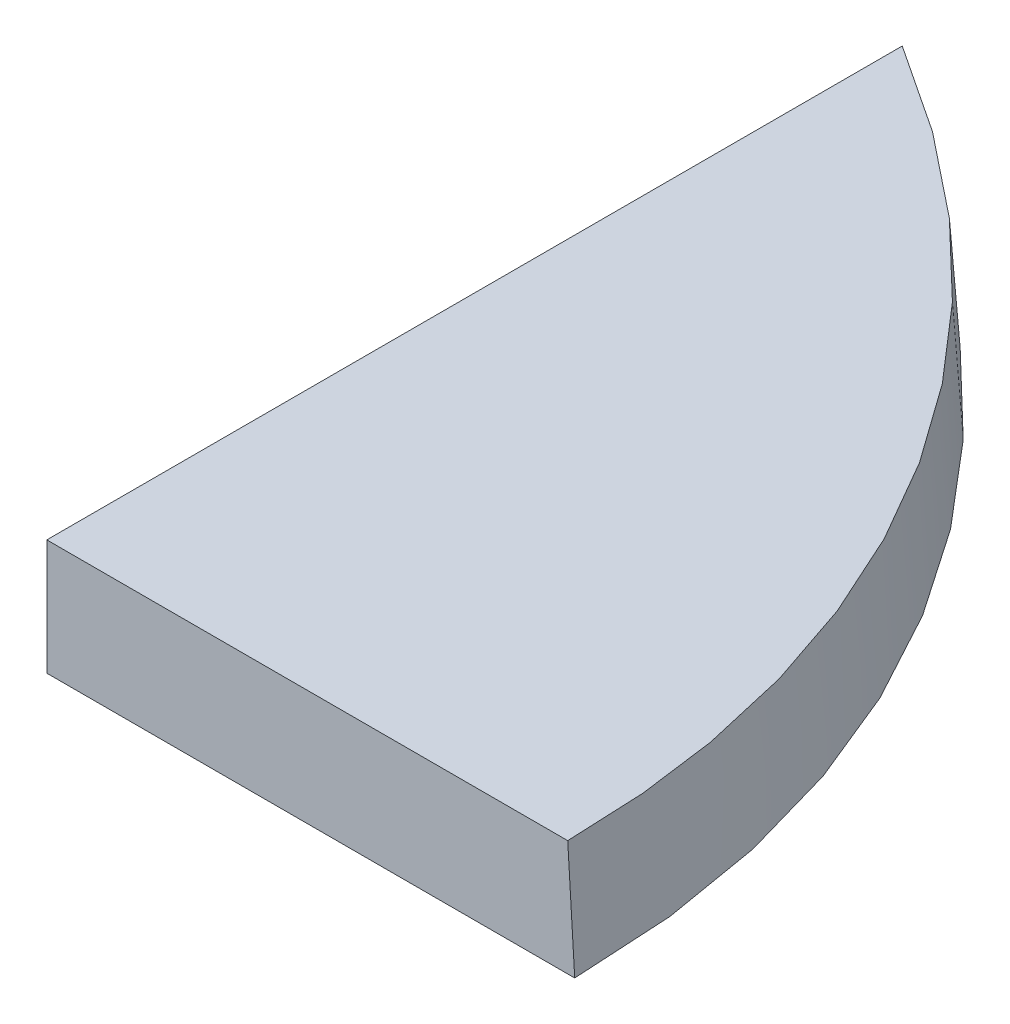
ISO-10303-21;
HEADER;
FILE_DESCRIPTION(('STEP AP214'),'2;1');
FILE_NAME('part.step','',(''),(''),'','','');
FILE_SCHEMA(('AUTOMOTIVE_DESIGN { 1 0 10303 214 1 1 1 1 }'));
ENDSEC;
DATA;
#1=APPLICATION_CONTEXT('core data for automotive mechanical design processes');
#2=APPLICATION_PROTOCOL_DEFINITION('international standard','automotive_design',2000,#1);
#3=PRODUCT_CONTEXT('',#1,'mechanical');
#4=PRODUCT('Part','Part','',(#3));
#5=PRODUCT_RELATED_PRODUCT_CATEGORY('part','',(#4));
#6=PRODUCT_DEFINITION_FORMATION('','',#4);
#7=PRODUCT_DEFINITION_CONTEXT('part definition',#1,'design');
#8=PRODUCT_DEFINITION('design','',#6,#7);
#9=PRODUCT_DEFINITION_SHAPE('','',#8);
#10=(LENGTH_UNIT() NAMED_UNIT(*) SI_UNIT(.MILLI.,.METRE.));
#11=(NAMED_UNIT(*) PLANE_ANGLE_UNIT() SI_UNIT($,.RADIAN.));
#12=(NAMED_UNIT(*) SI_UNIT($,.STERADIAN.) SOLID_ANGLE_UNIT());
#13=UNCERTAINTY_MEASURE_WITH_UNIT(LENGTH_MEASURE(1.E-05),#10,'distance_accuracy_value','');
#14=(GEOMETRIC_REPRESENTATION_CONTEXT(3) GLOBAL_UNCERTAINTY_ASSIGNED_CONTEXT((#13)) GLOBAL_UNIT_ASSIGNED_CONTEXT((#10,
#11,#12)) REPRESENTATION_CONTEXT('',''));
#15=CARTESIAN_POINT('',(0.,0.,0.));
#16=DIRECTION('',(0.,0.,1.));
#17=DIRECTION('',(1.,0.,0.));
#18=AXIS2_PLACEMENT_3D('',#15,#16,#17);
#19=CARTESIAN_POINT('',(0.,0.,0.));
#20=DIRECTION('',(0.,0.,1.));
#21=DIRECTION('',(1.,0.,0.));
#22=AXIS2_PLACEMENT_3D('',#19,#20,#21);
#23=PLANE('',#22);
#24=CARTESIAN_POINT('',(37.2881564006706,-186.5,0.));
#25=CARTESIAN_POINT('',(37.3587709337804,-187.666666666667,0.));
#26=CARTESIAN_POINT('',(37.4293854668902,-188.833333333333,0.));
#27=CARTESIAN_POINT('',(37.5,-190.,0.));
#28=B_SPLINE_CURVE_WITH_KNOTS('',3,(#24,#25,#26,#27),.UNSPECIFIED.,.F.,.F.,(4,4),(0.,
3.50640524049584),.UNSPECIFIED.);
#29=CARTESIAN_POINT('',(37.2881564006706,-186.5,0.));
#30=VERTEX_POINT('',#29);
#31=CARTESIAN_POINT('',(37.5,-190.,0.));
#32=VERTEX_POINT('',#31);
#33=EDGE_CURVE('E82',#30,#32,#28,.T.);
#34=ORIENTED_EDGE('',*,*,#33,.F.);
#35=DIRECTION('',(1.,0.,0.));
#36=VECTOR('',#35,1.);
#37=CARTESIAN_POINT('',(0.,-186.5,0.));
#38=LINE('',#37,#36);
#39=CARTESIAN_POINT('',(21.5000000005769,-186.5,0.));
#40=VERTEX_POINT('',#39);
#41=EDGE_CURVE('E54',#40,#30,#38,.T.);
#42=ORIENTED_EDGE('',*,*,#41,.F.);
#43=DIRECTION('',(0.,-1.,0.));
#44=VECTOR('',#43,1.);
#45=CARTESIAN_POINT('',(21.4999999999996,0.,0.));
#46=LINE('',#45,#44);
#47=CARTESIAN_POINT('',(21.5,-190.,0.));
#48=VERTEX_POINT('',#47);
#49=EDGE_CURVE('E81',#40,#48,#46,.T.);
#50=ORIENTED_EDGE('',*,*,#49,.T.);
#51=DIRECTION('',(1.,0.,0.));
#52=VECTOR('',#51,1.);
#53=CARTESIAN_POINT('',(0.,-190.,0.));
#54=LINE('',#53,#52);
#55=EDGE_CURVE('E89',#48,#32,#54,.T.);
#56=ORIENTED_EDGE('',*,*,#55,.T.);
#57=EDGE_LOOP('',(#34,#42,#50,#56));
#58=FACE_BOUND('',#57,.T.);
#59=ADVANCED_FACE('F43',(#58),#23,.T.);
#60=CARTESIAN_POINT('',(0.086150742203567,-186.5,-28.2226236497702));
#61=DIRECTION('',(0.,1.,0.));
#62=DIRECTION('',(0.,0.,1.));
#63=AXIS2_PLACEMENT_3D('',#60,#61,#62);
#64=PLANE('',#63);
#65=CARTESIAN_POINT('',(21.5,-186.5,-25.92670507502));
#66=CARTESIAN_POINT('',(21.9332720499597,-186.5,-25.6664931176836));
#67=CARTESIAN_POINT('',(22.3613558977964,-186.5,-25.3976088622762));
#68=CARTESIAN_POINT('',(23.206587700079,-186.5,-24.8423953489897));
#69=CARTESIAN_POINT('',(23.6237258097293,-186.5,-24.5560511079549));
#70=CARTESIAN_POINT('',(24.4459310154746,-186.5,-23.9661401850042));
#71=CARTESIAN_POINT('',(24.8509926849779,-186.5,-23.6625659334659));
#72=CARTESIAN_POINT('',(25.6479262213686,-186.5,-23.0384647112297));
#73=CARTESIAN_POINT('',(26.0397964484247,-186.5,-22.7179356455163));
#74=CARTESIAN_POINT('',(26.812280076892,-186.5,-22.0576400249726));
#75=CARTESIAN_POINT('',(27.1927822947734,-186.5,-21.7177432971023));
#76=CARTESIAN_POINT('',(27.9381754567255,-186.5,-21.0213836808423));
#77=CARTESIAN_POINT('',(28.3030695839484,-186.5,-20.6649242015367));
#78=CARTESIAN_POINT('',(29.0161775866711,-186.5,-19.9358025278229));
#79=CARTESIAN_POINT('',(29.3643944279261,-186.5,-19.563143236914));
#80=CARTESIAN_POINT('',(30.0430865239549,-186.5,-18.8020249773714));
#81=CARTESIAN_POINT('',(30.3735621005561,-186.5,-18.4135662955641));
#82=CARTESIAN_POINT('',(31.1112393886738,-186.5,-17.5034164370623));
#83=CARTESIAN_POINT('',(31.5120040065544,-186.5,-16.9764810177813));
#84=CARTESIAN_POINT('',(32.2793090120161,-186.5,-15.8981767147226));
#85=CARTESIAN_POINT('',(32.6458461938757,-186.5,-15.3468055494246));
#86=CARTESIAN_POINT('',(33.3422402359291,-186.5,-14.2212394397558));
#87=CARTESIAN_POINT('',(33.6720926586906,-186.5,-13.6470417456393));
#88=CARTESIAN_POINT('',(34.2910096729874,-186.5,-12.4809445190112));
#89=CARTESIAN_POINT('',(34.580281280983,-186.5,-11.8891550034054));
#90=CARTESIAN_POINT('',(35.1178241515346,-186.5,-10.6873057127574));
#91=CARTESIAN_POINT('',(35.3660999687781,-186.5,-10.0772479762481));
#92=CARTESIAN_POINT('',(35.8195504441266,-186.5,-8.84155952345006));
#93=CARTESIAN_POINT('',(36.024744325075,-186.5,-8.21593589252137));
#94=CARTESIAN_POINT('',(36.3259282359621,-186.5,-7.17458830390656));
#95=CARTESIAN_POINT('',(36.4349211631765,-186.5,-6.76257868949283));
#96=CARTESIAN_POINT('',(36.6337121663088,-186.5,-5.9340439830241));
#97=CARTESIAN_POINT('',(36.7235151088263,-186.5,-5.51752006402227));
#98=CARTESIAN_POINT('',(36.8835907931675,-186.5,-4.68080414973628));
#99=CARTESIAN_POINT('',(36.9538664837641,-186.5,-4.26061271817121));
#100=CARTESIAN_POINT('',(37.0749114508205,-186.5,-3.41543129587202));
#101=CARTESIAN_POINT('',(37.1255884779378,-186.5,-2.99042807632386));
#102=CARTESIAN_POINT('',(37.2067663233151,-186.5,-2.13842353543799));
#103=CARTESIAN_POINT('',(37.2372636248871,-186.5,-1.71142187888629));
#104=CARTESIAN_POINT('',(37.2779684897224,-186.5,-0.856281491737584));
#105=CARTESIAN_POINT('',(37.2881679153541,-186.5,-0.428142373971425));
#106=CARTESIAN_POINT('',(37.2881564006706,-186.5,0.));
#107=B_SPLINE_CURVE_WITH_KNOTS('',3,(#65,#66,#67,#68,#69,#70,#71,#72,#73,#74,#75,#76,#77,#78,
#79,#80,#81,#82,#83,#84,#85,#86,#87,#88,#89,#90,#91,#92,#93,#94,#95,#96,#97,#98,#99,#100,#101,
#102,#103,#104,#105,#106),.UNSPECIFIED.,.F.,.F.,(4,2,2,2,2,2,2,2,2,2,2,2,2,2,2,2,2,2,2,2,4),(0.,
1.51614189688399,3.03360368760739,4.5517373808764,6.07005910199755,7.60018340381872,
9.12999414582555,10.6595318206306,12.1890417401777,14.173758935756,16.1586618327213,
18.1438045653791,20.1184203715777,22.0928166474837,24.0663300812564,25.3444675768771,
26.622280549842,27.8999004577189,29.1834628812915,30.4672489303324,31.7515495590827),.UNSPECIFIED.);
#108=CARTESIAN_POINT('',(21.5,-186.5,-25.92670507502));
#109=VERTEX_POINT('',#108);
#110=EDGE_CURVE('E88',#109,#30,#107,.T.);
#111=ORIENTED_EDGE('',*,*,#110,.F.);
#112=DIRECTION('',(0.,0.,-1.));
#113=VECTOR('',#112,1.);
#114=CARTESIAN_POINT('',(21.5,-186.5,20.8978327647945));
#115=LINE('',#114,#113);
#116=EDGE_CURVE('E65',#40,#109,#115,.T.);
#117=ORIENTED_EDGE('',*,*,#116,.F.);
#118=ORIENTED_EDGE('',*,*,#41,.T.);
#119=EDGE_LOOP('',(#111,#117,#118));
#120=FACE_BOUND('',#119,.T.);
#121=ADVANCED_FACE('F90',(#120),#64,.T.);
#122=CARTESIAN_POINT('',(21.5,-176.5,20.8978327647945));
#123=DIRECTION('',(-1.,0.,0.));
#124=DIRECTION('',(0.,-1.,0.));
#125=AXIS2_PLACEMENT_3D('',#122,#123,#124);
#126=PLANE('',#125);
#127=CARTESIAN_POINT('',(21.5000000000001,-190.,-26.2183108193915));
#128=CARTESIAN_POINT('',(21.5000000000001,-189.416665155996,-26.169727993826));
#129=CARTESIAN_POINT('',(21.5000000000001,-188.833331067328,-26.1211361023456));
#130=CARTESIAN_POINT('',(21.5,-187.666664400661,-26.0239341875551));
#131=CARTESIAN_POINT('',(21.5,-187.083331822663,-25.975324164245));
#132=CARTESIAN_POINT('',(21.5,-186.5,-25.92670507502));
#133=B_SPLINE_CURVE_WITH_KNOTS('',3,(#127,#128,#129,#130,#131,#132),.UNSPECIFIED.,.F.,.F.,(4,2,
4),(0.,1.7560633468877,3.51212669377542),.UNSPECIFIED.);
#134=CARTESIAN_POINT('',(21.4999994350566,-190.,-26.2183124401896));
#135=VERTEX_POINT('',#134);
#136=EDGE_CURVE('E108',#135,#109,#133,.T.);
#137=ORIENTED_EDGE('',*,*,#136,.F.);
#138=DIRECTION('',(0.,0.,1.));
#139=VECTOR('',#138,1.);
#140=CARTESIAN_POINT('',(21.5000000000001,-190.,0.));
#141=LINE('',#140,#139);
#142=EDGE_CURVE('E92',#135,#48,#141,.T.);
#143=ORIENTED_EDGE('',*,*,#142,.T.);
#144=ORIENTED_EDGE('',*,*,#49,.F.);
#145=ORIENTED_EDGE('',*,*,#116,.T.);
#146=EDGE_LOOP('',(#137,#143,#144,#145));
#147=FACE_BOUND('',#146,.T.);
#148=ADVANCED_FACE('F95',(#147),#126,.T.);
#149=CARTESIAN_POINT('',(-0.0942476803876341,-190.,31.9998989353041));
#150=CARTESIAN_POINT('',(0.,0.,17.5));
#151=CARTESIAN_POINT('',(0.000942476803874733,1.9,17.355001010647));
#152=CARTESIAN_POINT('',(74.9055154492315,-190.,32.1607483098324));
#153=CARTESIAN_POINT('',(52.,0.,17.5));
#154=CARTESIAN_POINT('',(51.7709448455077,1.9,17.3533925169017));
#155=CARTESIAN_POINT('',(75.0940108100067,-190.,-31.839049560776));
#156=CARTESIAN_POINT('',(52.,0.,-17.5));
#157=CARTESIAN_POINT('',(51.7690598918999,1.9,-17.3566095043922));
#158=CARTESIAN_POINT('',(0.0942476803875962,-190.,-31.9998989353041));
#159=CARTESIAN_POINT('',(0.,0.,-17.5));
#160=CARTESIAN_POINT('',(-0.000942476803871138,1.9,-17.355001010647));
#161=CARTESIAN_POINT('',(-74.9055154492314,-190.,-32.1607483098323));
#162=CARTESIAN_POINT('',(-52.,0.,-17.5));
#163=CARTESIAN_POINT('',(-51.7709448455077,1.9,-17.3533925169017));
#164=CARTESIAN_POINT('',(-75.0940108100066,-190.,31.839049560776));
#165=CARTESIAN_POINT('',(-52.,0.,17.5));
#166=CARTESIAN_POINT('',(-51.7690598918999,1.9,17.3566095043922));
#167=CARTESIAN_POINT('',(-0.0942476803876341,-190.,31.9998989353041));
#168=CARTESIAN_POINT('',(0.,0.,17.5));
#169=CARTESIAN_POINT('',(0.000942476803874733,1.9,17.355001010647));
#170=(BOUNDED_SURFACE() B_SPLINE_SURFACE(3,1,((#149,#150,#151),(#152,#153,#154),(#155,#156,
#157),(#158,#159,#160),(#161,#162,#163),(#164,#165,#166),(#167,#168,#169)),.UNSPECIFIED.,.T.,
.F.,.F.) B_SPLINE_SURFACE_WITH_KNOTS((4,3,4),(2,1,2),(0.,0.5,1.),(0.,1.,1.01),
.UNSPECIFIED.) GEOMETRIC_REPRESENTATION_ITEM() RATIONAL_B_SPLINE_SURFACE(((1.,1.,1.),
(0.333333333333333,0.333333333333333,0.333333333333333),(0.333333333333333,0.333333333333333,
0.333333333333333),(1.,1.,1.),(0.333333333333333,0.333333333333333,0.333333333333333),
(0.333333333333333,0.333333333333333,0.333333333333333),(1.,1.,1.))) REPRESENTATION_ITEM('') SURFACE());
#171=CARTESIAN_POINT('',(0.,-190.,0.));
#172=DIRECTION('',(0.,1.,0.));
#173=DIRECTION('',(1.,0.,0.));
#174=AXIS2_PLACEMENT_3D('',#171,#172,#173);
#175=ELLIPSE('',#174,37.5,32.);
#176=EDGE_CURVE('E11',#32,#135,#175,.T.);
#177=ORIENTED_EDGE('',*,*,#136,.T.);
#178=ORIENTED_EDGE('',*,*,#110,.T.);
#179=ORIENTED_EDGE('',*,*,#33,.T.);
#180=ORIENTED_EDGE('',*,*,#176,.T.);
#181=EDGE_LOOP('',(#177,#178,#179,#180));
#182=FACE_BOUND('',#181,.T.);
#183=ADVANCED_FACE('F44',(#182),#170,.T.);
#184=CARTESIAN_POINT('',(0.,-190.,0.));
#185=DIRECTION('',(0.,1.,0.));
#186=DIRECTION('',(0.,0.,1.));
#187=AXIS2_PLACEMENT_3D('',#184,#185,#186);
#188=PLANE('',#187);
#189=ORIENTED_EDGE('',*,*,#142,.F.);
#190=ORIENTED_EDGE('',*,*,#176,.F.);
#191=ORIENTED_EDGE('',*,*,#55,.F.);
#192=EDGE_LOOP('',(#189,#190,#191));
#193=FACE_BOUND('',#192,.T.);
#194=ADVANCED_FACE('F124',(#193),#188,.F.);
#195=CLOSED_SHELL('',(#59,#121,#148,#183,#194));
#196=MANIFOLD_SOLID_BREP('B2',#195);
#197=ADVANCED_BREP_SHAPE_REPRESENTATION('',(#18,#196),#14);
#198=SHAPE_DEFINITION_REPRESENTATION(#9,#197);
ENDSEC;
END-ISO-10303-21;
